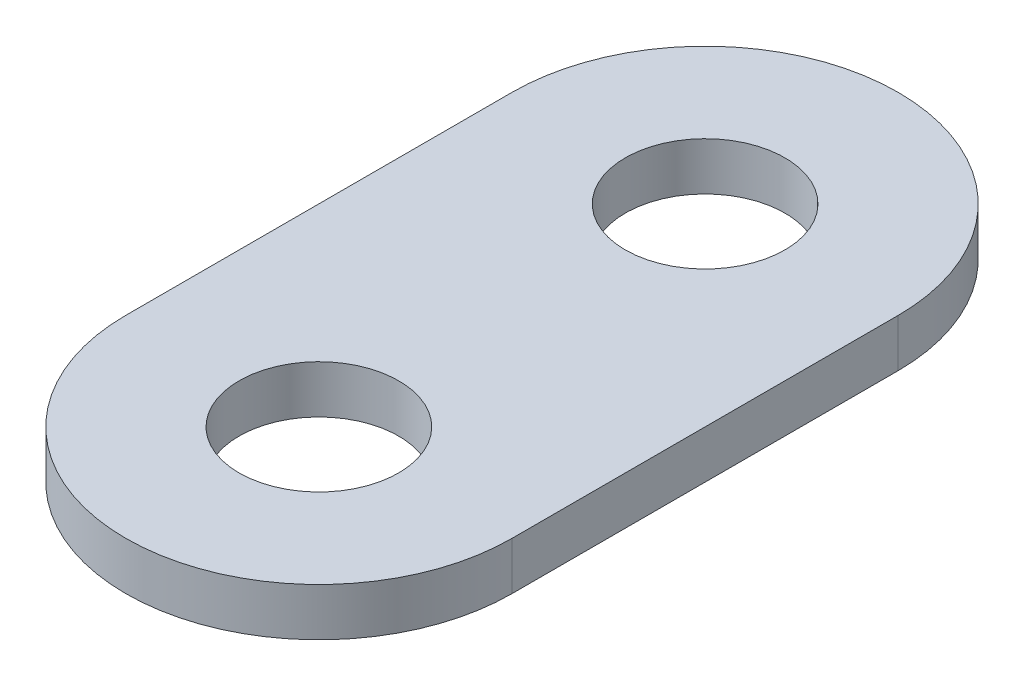
ISO-10303-21;
HEADER;
FILE_DESCRIPTION(('STEP AP214'),'2;1');
FILE_NAME('part.step','',(''),(''),'','','');
FILE_SCHEMA(('AUTOMOTIVE_DESIGN { 1 0 10303 214 1 1 1 1 }'));
ENDSEC;
DATA;
#1=APPLICATION_CONTEXT('core data for automotive mechanical design processes');
#2=APPLICATION_PROTOCOL_DEFINITION('international standard','automotive_design',2000,#1);
#3=PRODUCT_CONTEXT('',#1,'mechanical');
#4=PRODUCT('Part','Part','',(#3));
#5=PRODUCT_RELATED_PRODUCT_CATEGORY('part','',(#4));
#6=PRODUCT_DEFINITION_FORMATION('','',#4);
#7=PRODUCT_DEFINITION_CONTEXT('part definition',#1,'design');
#8=PRODUCT_DEFINITION('design','',#6,#7);
#9=PRODUCT_DEFINITION_SHAPE('','',#8);
#10=(LENGTH_UNIT() NAMED_UNIT(*) SI_UNIT(.MILLI.,.METRE.));
#11=(NAMED_UNIT(*) PLANE_ANGLE_UNIT() SI_UNIT($,.RADIAN.));
#12=(NAMED_UNIT(*) SI_UNIT($,.STERADIAN.) SOLID_ANGLE_UNIT());
#13=UNCERTAINTY_MEASURE_WITH_UNIT(LENGTH_MEASURE(1.E-05),#10,'distance_accuracy_value','');
#14=(GEOMETRIC_REPRESENTATION_CONTEXT(3) GLOBAL_UNCERTAINTY_ASSIGNED_CONTEXT((#13)) GLOBAL_UNIT_ASSIGNED_CONTEXT((#10,
#11,#12)) REPRESENTATION_CONTEXT('',''));
#15=CARTESIAN_POINT('',(0.,0.,0.));
#16=DIRECTION('',(0.,0.,1.));
#17=DIRECTION('',(1.,0.,0.));
#18=AXIS2_PLACEMENT_3D('',#15,#16,#17);
#19=CARTESIAN_POINT('',(0.,-1.,0.));
#20=DIRECTION('',(0.,1.,0.));
#21=DIRECTION('',(0.,0.,1.));
#22=AXIS2_PLACEMENT_3D('',#19,#20,#21);
#23=CYLINDRICAL_SURFACE('',#22,7.5);
#24=DIRECTION('',(0.,1.,0.));
#25=VECTOR('',#24,1.);
#26=CARTESIAN_POINT('',(7.5,-1.,0.));
#27=LINE('',#26,#25);
#28=CARTESIAN_POINT('',(7.5,-1.,0.));
#29=VERTEX_POINT('',#28);
#30=CARTESIAN_POINT('',(7.5,0.86,0.));
#31=VERTEX_POINT('',#30);
#32=EDGE_CURVE('E36',#29,#31,#27,.T.);
#33=ORIENTED_EDGE('',*,*,#32,.T.);
#34=CARTESIAN_POINT('',(0.,0.86,0.));
#35=DIRECTION('',(0.,1.,0.));
#36=DIRECTION('',(0.,0.,1.));
#37=AXIS2_PLACEMENT_3D('',#34,#35,#36);
#38=CIRCLE('',#37,7.5);
#39=CARTESIAN_POINT('',(-7.5,0.86,0.));
#40=VERTEX_POINT('',#39);
#41=EDGE_CURVE('E73',#40,#31,#38,.T.);
#42=ORIENTED_EDGE('',*,*,#41,.F.);
#43=DIRECTION('',(0.,1.,0.));
#44=VECTOR('',#43,1.);
#45=CARTESIAN_POINT('',(-7.5,-1.,0.));
#46=LINE('',#45,#44);
#47=CARTESIAN_POINT('',(-7.5,-1.,0.));
#48=VERTEX_POINT('',#47);
#49=EDGE_CURVE('E11',#48,#40,#46,.T.);
#50=ORIENTED_EDGE('',*,*,#49,.F.);
#51=CARTESIAN_POINT('',(0.,-1.,0.));
#52=DIRECTION('',(0.,1.,0.));
#53=DIRECTION('',(0.,0.,1.));
#54=AXIS2_PLACEMENT_3D('',#51,#52,#53);
#55=CIRCLE('',#54,7.5);
#56=EDGE_CURVE('E74',#48,#29,#55,.T.);
#57=ORIENTED_EDGE('',*,*,#56,.T.);
#58=EDGE_LOOP('',(#33,#42,#50,#57));
#59=FACE_BOUND('',#58,.T.);
#60=ADVANCED_FACE('F33',(#59),#23,.T.);
#61=CARTESIAN_POINT('',(-7.5,-1.,0.));
#62=DIRECTION('',(-1.,0.,0.));
#63=DIRECTION('',(0.,0.,1.));
#64=AXIS2_PLACEMENT_3D('',#61,#62,#63);
#65=PLANE('',#64);
#66=ORIENTED_EDGE('',*,*,#49,.T.);
#67=DIRECTION('',(0.,0.,1.));
#68=VECTOR('',#67,1.);
#69=CARTESIAN_POINT('',(-7.5,0.86,0.));
#70=LINE('',#69,#68);
#71=CARTESIAN_POINT('',(-7.5,0.86,-15.));
#72=VERTEX_POINT('',#71);
#73=EDGE_CURVE('E91',#72,#40,#70,.T.);
#74=ORIENTED_EDGE('',*,*,#73,.F.);
#75=DIRECTION('',(0.,1.,0.));
#76=VECTOR('',#75,1.);
#77=CARTESIAN_POINT('',(-7.5,-1.,-15.));
#78=LINE('',#77,#76);
#79=CARTESIAN_POINT('',(-7.5,-1.,-15.));
#80=VERTEX_POINT('',#79);
#81=EDGE_CURVE('E41',#80,#72,#78,.T.);
#82=ORIENTED_EDGE('',*,*,#81,.F.);
#83=DIRECTION('',(0.,0.,1.));
#84=VECTOR('',#83,1.);
#85=CARTESIAN_POINT('',(-7.5,-1.,0.));
#86=LINE('',#85,#84);
#87=EDGE_CURVE('E79',#80,#48,#86,.T.);
#88=ORIENTED_EDGE('',*,*,#87,.T.);
#89=EDGE_LOOP('',(#66,#74,#82,#88));
#90=FACE_BOUND('',#89,.T.);
#91=ADVANCED_FACE('F117',(#90),#65,.T.);
#92=CARTESIAN_POINT('',(0.,-1.,-15.));
#93=DIRECTION('',(0.,1.,0.));
#94=DIRECTION('',(0.,0.,1.));
#95=AXIS2_PLACEMENT_3D('',#92,#93,#94);
#96=CYLINDRICAL_SURFACE('',#95,7.5);
#97=ORIENTED_EDGE('',*,*,#81,.T.);
#98=CARTESIAN_POINT('',(0.,0.86,-15.));
#99=DIRECTION('',(0.,1.,0.));
#100=DIRECTION('',(0.,0.,1.));
#101=AXIS2_PLACEMENT_3D('',#98,#99,#100);
#102=CIRCLE('',#101,7.5);
#103=CARTESIAN_POINT('',(7.5,0.86,-15.));
#104=VERTEX_POINT('',#103);
#105=EDGE_CURVE('E86',#104,#72,#102,.T.);
#106=ORIENTED_EDGE('',*,*,#105,.F.);
#107=DIRECTION('',(0.,1.,0.));
#108=VECTOR('',#107,1.);
#109=CARTESIAN_POINT('',(7.5,-1.,-15.));
#110=LINE('',#109,#108);
#111=CARTESIAN_POINT('',(7.5,-1.,-15.));
#112=VERTEX_POINT('',#111);
#113=EDGE_CURVE('E78',#112,#104,#110,.T.);
#114=ORIENTED_EDGE('',*,*,#113,.F.);
#115=CARTESIAN_POINT('',(0.,-1.,-15.));
#116=DIRECTION('',(0.,1.,0.));
#117=DIRECTION('',(0.,0.,1.));
#118=AXIS2_PLACEMENT_3D('',#115,#116,#117);
#119=CIRCLE('',#118,7.5);
#120=EDGE_CURVE('E110',#112,#80,#119,.T.);
#121=ORIENTED_EDGE('',*,*,#120,.T.);
#122=EDGE_LOOP('',(#97,#106,#114,#121));
#123=FACE_BOUND('',#122,.T.);
#124=ADVANCED_FACE('F114',(#123),#96,.T.);
#125=CARTESIAN_POINT('',(7.5,-1.,0.));
#126=DIRECTION('',(1.,0.,0.));
#127=DIRECTION('',(0.,0.,-1.));
#128=AXIS2_PLACEMENT_3D('',#125,#126,#127);
#129=PLANE('',#128);
#130=ORIENTED_EDGE('',*,*,#113,.T.);
#131=DIRECTION('',(0.,0.,-1.));
#132=VECTOR('',#131,1.);
#133=CARTESIAN_POINT('',(7.5,0.86,0.));
#134=LINE('',#133,#132);
#135=EDGE_CURVE('E81',#31,#104,#134,.T.);
#136=ORIENTED_EDGE('',*,*,#135,.F.);
#137=ORIENTED_EDGE('',*,*,#32,.F.);
#138=DIRECTION('',(0.,0.,-1.));
#139=VECTOR('',#138,1.);
#140=CARTESIAN_POINT('',(7.5,-1.,0.));
#141=LINE('',#140,#139);
#142=EDGE_CURVE('E108',#29,#112,#141,.T.);
#143=ORIENTED_EDGE('',*,*,#142,.T.);
#144=EDGE_LOOP('',(#130,#136,#137,#143));
#145=FACE_BOUND('',#144,.T.);
#146=ADVANCED_FACE('F82',(#145),#129,.T.);
#147=CARTESIAN_POINT('',(0.,-1.,0.));
#148=DIRECTION('',(0.,1.,0.));
#149=DIRECTION('',(0.,0.,1.));
#150=AXIS2_PLACEMENT_3D('',#147,#148,#149);
#151=PLANE('',#150);
#152=CARTESIAN_POINT('',(0.,-1.,-15.));
#153=DIRECTION('',(0.,1.,0.));
#154=DIRECTION('',(0.,0.,1.));
#155=AXIS2_PLACEMENT_3D('',#152,#153,#154);
#156=CIRCLE('',#155,3.1);
#157=CARTESIAN_POINT('',(0.,-1.,-11.9));
#158=VERTEX_POINT('',#157);
#159=EDGE_CURVE('E101',#158,#158,#156,.T.);
#160=ORIENTED_EDGE('',*,*,#159,.T.);
#161=EDGE_LOOP('',(#160));
#162=FACE_BOUND('',#161,.T.);
#163=CARTESIAN_POINT('',(0.,-1.,0.));
#164=DIRECTION('',(0.,1.,0.));
#165=DIRECTION('',(0.,0.,1.));
#166=AXIS2_PLACEMENT_3D('',#163,#164,#165);
#167=CIRCLE('',#166,3.1);
#168=CARTESIAN_POINT('',(0.,-1.,3.1));
#169=VERTEX_POINT('',#168);
#170=EDGE_CURVE('E104',#169,#169,#167,.T.);
#171=ORIENTED_EDGE('',*,*,#170,.T.);
#172=EDGE_LOOP('',(#171));
#173=FACE_BOUND('',#172,.T.);
#174=ORIENTED_EDGE('',*,*,#56,.F.);
#175=ORIENTED_EDGE('',*,*,#87,.F.);
#176=ORIENTED_EDGE('',*,*,#120,.F.);
#177=ORIENTED_EDGE('',*,*,#142,.F.);
#178=EDGE_LOOP('',(#174,#175,#176,#177));
#179=FACE_BOUND('',#178,.T.);
#180=ADVANCED_FACE('F119',(#162,#173,#179),#151,.F.);
#181=CARTESIAN_POINT('',(0.,-1.,0.));
#182=DIRECTION('',(0.,1.,0.));
#183=DIRECTION('',(0.,0.,1.));
#184=AXIS2_PLACEMENT_3D('',#181,#182,#183);
#185=CYLINDRICAL_SURFACE('',#184,3.1);
#186=ORIENTED_EDGE('',*,*,#170,.F.);
#187=EDGE_LOOP('',(#186));
#188=FACE_BOUND('',#187,.T.);
#189=CARTESIAN_POINT('',(0.,0.86,0.));
#190=DIRECTION('',(0.,1.,0.));
#191=DIRECTION('',(0.,0.,1.));
#192=AXIS2_PLACEMENT_3D('',#189,#190,#191);
#193=CIRCLE('',#192,3.1);
#194=CARTESIAN_POINT('',(0.,0.86,3.1));
#195=VERTEX_POINT('',#194);
#196=EDGE_CURVE('E92',#195,#195,#193,.T.);
#197=ORIENTED_EDGE('',*,*,#196,.T.);
#198=EDGE_LOOP('',(#197));
#199=FACE_BOUND('',#198,.T.);
#200=ADVANCED_FACE('F121',(#188,#199),#185,.F.);
#201=CARTESIAN_POINT('',(0.,-1.,-15.));
#202=DIRECTION('',(0.,1.,0.));
#203=DIRECTION('',(0.,0.,1.));
#204=AXIS2_PLACEMENT_3D('',#201,#202,#203);
#205=CYLINDRICAL_SURFACE('',#204,3.1);
#206=ORIENTED_EDGE('',*,*,#159,.F.);
#207=EDGE_LOOP('',(#206));
#208=FACE_BOUND('',#207,.T.);
#209=CARTESIAN_POINT('',(0.,0.86,-15.));
#210=DIRECTION('',(0.,1.,0.));
#211=DIRECTION('',(0.,0.,1.));
#212=AXIS2_PLACEMENT_3D('',#209,#210,#211);
#213=CIRCLE('',#212,3.1);
#214=CARTESIAN_POINT('',(0.,0.86,-11.9));
#215=VERTEX_POINT('',#214);
#216=EDGE_CURVE('E95',#215,#215,#213,.T.);
#217=ORIENTED_EDGE('',*,*,#216,.T.);
#218=EDGE_LOOP('',(#217));
#219=FACE_BOUND('',#218,.T.);
#220=ADVANCED_FACE('F128',(#208,#219),#205,.F.);
#221=CARTESIAN_POINT('',(0.,0.86,0.));
#222=DIRECTION('',(0.,1.,0.));
#223=DIRECTION('',(0.,0.,1.));
#224=AXIS2_PLACEMENT_3D('',#221,#222,#223);
#225=PLANE('',#224);
#226=ORIENTED_EDGE('',*,*,#196,.F.);
#227=EDGE_LOOP('',(#226));
#228=FACE_BOUND('',#227,.T.);
#229=ORIENTED_EDGE('',*,*,#41,.T.);
#230=ORIENTED_EDGE('',*,*,#135,.T.);
#231=ORIENTED_EDGE('',*,*,#105,.T.);
#232=ORIENTED_EDGE('',*,*,#73,.T.);
#233=EDGE_LOOP('',(#229,#230,#231,#232));
#234=FACE_BOUND('',#233,.T.);
#235=ORIENTED_EDGE('',*,*,#216,.F.);
#236=EDGE_LOOP('',(#235));
#237=FACE_BOUND('',#236,.T.);
#238=ADVANCED_FACE('F89',(#228,#234,#237),#225,.T.);
#239=CLOSED_SHELL('',(#60,#91,#124,#146,#180,#200,#220,#238));
#240=MANIFOLD_SOLID_BREP('B2',#239);
#241=ADVANCED_BREP_SHAPE_REPRESENTATION('',(#18,#240),#14);
#242=SHAPE_DEFINITION_REPRESENTATION(#9,#241);
ENDSEC;
END-ISO-10303-21;
